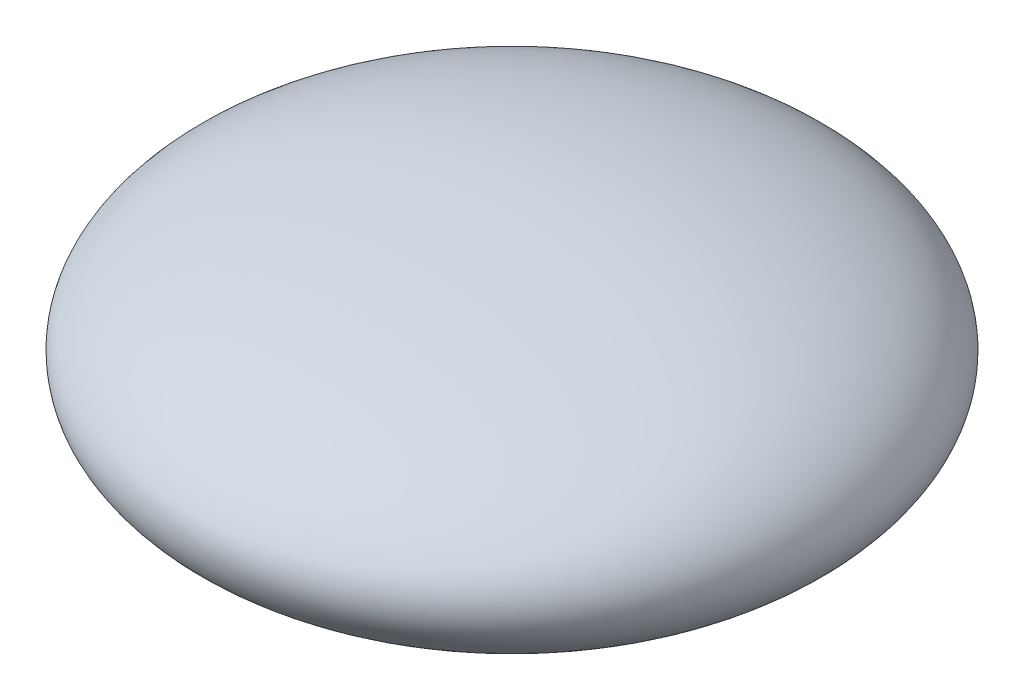
ISO-10303-21;
HEADER;
FILE_DESCRIPTION(('STEP AP214'),'2;1');
FILE_NAME('part.step','',(''),(''),'','','');
FILE_SCHEMA(('AUTOMOTIVE_DESIGN { 1 0 10303 214 1 1 1 1 }'));
ENDSEC;
DATA;
#1=APPLICATION_CONTEXT('core data for automotive mechanical design processes');
#2=APPLICATION_PROTOCOL_DEFINITION('international standard','automotive_design',2000,#1);
#3=PRODUCT_CONTEXT('',#1,'mechanical');
#4=PRODUCT('Part','Part','',(#3));
#5=PRODUCT_RELATED_PRODUCT_CATEGORY('part','',(#4));
#6=PRODUCT_DEFINITION_FORMATION('','',#4);
#7=PRODUCT_DEFINITION_CONTEXT('part definition',#1,'design');
#8=PRODUCT_DEFINITION('design','',#6,#7);
#9=PRODUCT_DEFINITION_SHAPE('','',#8);
#10=(LENGTH_UNIT() NAMED_UNIT(*) SI_UNIT(.MILLI.,.METRE.));
#11=(NAMED_UNIT(*) PLANE_ANGLE_UNIT() SI_UNIT($,.RADIAN.));
#12=(NAMED_UNIT(*) SI_UNIT($,.STERADIAN.) SOLID_ANGLE_UNIT());
#13=UNCERTAINTY_MEASURE_WITH_UNIT(LENGTH_MEASURE(1.E-05),#10,'distance_accuracy_value','');
#14=(GEOMETRIC_REPRESENTATION_CONTEXT(3) GLOBAL_UNCERTAINTY_ASSIGNED_CONTEXT((#13)) GLOBAL_UNIT_ASSIGNED_CONTEXT((#10,
#11,#12)) REPRESENTATION_CONTEXT('',''));
#15=CARTESIAN_POINT('',(0.,0.,0.));
#16=DIRECTION('',(0.,0.,1.));
#17=DIRECTION('',(1.,0.,0.));
#18=AXIS2_PLACEMENT_3D('',#15,#16,#17);
#19=CARTESIAN_POINT('',(0.,0.,0.));
#20=DIRECTION('',(0.,0.,1.));
#21=DIRECTION('',(-1.,0.,0.));
#22=AXIS2_PLACEMENT_3D('',#19,#20,#21);
#23=ELLIPSE('',#22,1372.87,509.27);
#24=TRIMMED_CURVE('',#23,(PARAMETER_VALUE(4.71238898038469)),
(PARAMETER_VALUE(7.85398163397448)),.T.,.PARAMETER.);
#25=CARTESIAN_POINT('',(1.60215076968481E-13,509.27,0.));
#26=DIRECTION('',(0.,1.,0.));
#27=AXIS1_PLACEMENT('',#25,#26);
#28=SURFACE_OF_REVOLUTION('',#24,#27);
#29=CARTESIAN_POINT('',(0.,-509.27,0.));
#30=VERTEX_POINT('',#29);
#31=VERTEX_LOOP('',#30);
#32=FACE_BOUND('',#31,.T.);
#33=CARTESIAN_POINT('',(1.603140947123E-13,509.27,0.));
#34=VERTEX_POINT('',#33);
#35=VERTEX_LOOP('',#34);
#36=FACE_BOUND('',#35,.T.);
#37=ADVANCED_FACE('F38',(#32,#36),#28,.F.);
#38=CLOSED_SHELL('',(#37));
#39=CARTESIAN_POINT('',(0.,0.,0.));
#40=DIRECTION('',(0.,0.,-1.));
#41=DIRECTION('',(-1.,0.,0.));
#42=AXIS2_PLACEMENT_3D('',#39,#40,#41);
#43=ELLIPSE('',#42,1371.6,508.);
#44=TRIMMED_CURVE('',#43,(PARAMETER_VALUE(4.71238898038469)),
(PARAMETER_VALUE(7.85398163397448)),.T.,.PARAMETER.);
#45=CARTESIAN_POINT('',(1.60215076968481E-13,509.27,0.));
#46=DIRECTION('',(0.,1.,0.));
#47=AXIS1_PLACEMENT('',#45,#46);
#48=SURFACE_OF_REVOLUTION('',#44,#47);
#49=CARTESIAN_POINT('',(1.63834879876955E-13,508.,0.));
#50=VERTEX_POINT('',#49);
#51=VERTEX_LOOP('',#50);
#52=FACE_BOUND('',#51,.T.);
#53=CARTESIAN_POINT('',(-6.04975085136249E-13,-508.,0.));
#54=VERTEX_POINT('',#53);
#55=VERTEX_LOOP('',#54);
#56=FACE_BOUND('',#55,.T.);
#57=ADVANCED_FACE('F40',(#52,#56),#48,.F.);
#58=CLOSED_SHELL('',(#57));
#59=ORIENTED_CLOSED_SHELL('',*,#58,.T.);
#60=BREP_WITH_VOIDS('B2',#38,(#59));
#61=ADVANCED_BREP_SHAPE_REPRESENTATION('',(#18,#60),#14);
#62=SHAPE_DEFINITION_REPRESENTATION(#9,#61);
ENDSEC;
END-ISO-10303-21;
